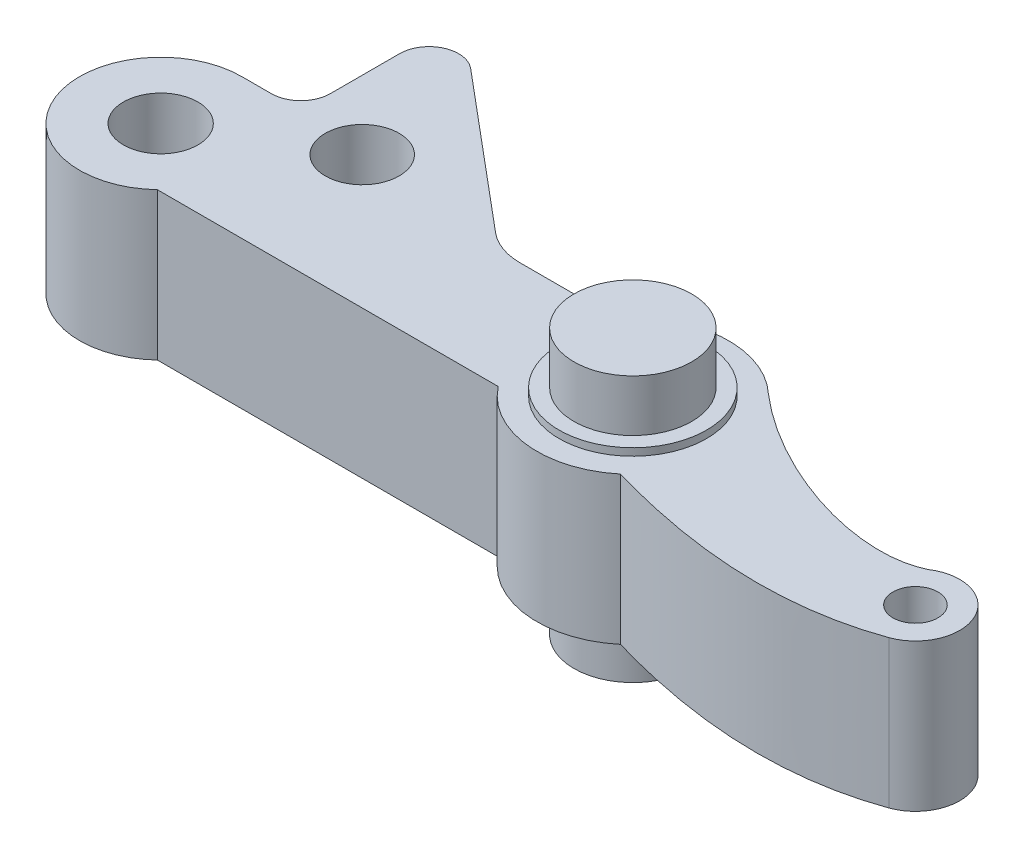
ISO-10303-21;
HEADER;
FILE_DESCRIPTION(('STEP AP214'),'2;1');
FILE_NAME('part.step','',(''),(''),'','','');
FILE_SCHEMA(('AUTOMOTIVE_DESIGN { 1 0 10303 214 1 1 1 1 }'));
ENDSEC;
DATA;
#1=APPLICATION_CONTEXT('core data for automotive mechanical design processes');
#2=APPLICATION_PROTOCOL_DEFINITION('international standard','automotive_design',2000,#1);
#3=PRODUCT_CONTEXT('',#1,'mechanical');
#4=PRODUCT('Part','Part','',(#3));
#5=PRODUCT_RELATED_PRODUCT_CATEGORY('part','',(#4));
#6=PRODUCT_DEFINITION_FORMATION('','',#4);
#7=PRODUCT_DEFINITION_CONTEXT('part definition',#1,'design');
#8=PRODUCT_DEFINITION('design','',#6,#7);
#9=PRODUCT_DEFINITION_SHAPE('','',#8);
#10=(LENGTH_UNIT() NAMED_UNIT(*) SI_UNIT(.MILLI.,.METRE.));
#11=(NAMED_UNIT(*) PLANE_ANGLE_UNIT() SI_UNIT($,.RADIAN.));
#12=(NAMED_UNIT(*) SI_UNIT($,.STERADIAN.) SOLID_ANGLE_UNIT());
#13=UNCERTAINTY_MEASURE_WITH_UNIT(LENGTH_MEASURE(1.E-05),#10,'distance_accuracy_value','');
#14=(GEOMETRIC_REPRESENTATION_CONTEXT(3) GLOBAL_UNCERTAINTY_ASSIGNED_CONTEXT((#13)) GLOBAL_UNIT_ASSIGNED_CONTEXT((#10,
#11,#12)) REPRESENTATION_CONTEXT('',''));
#15=CARTESIAN_POINT('',(0.,0.,0.));
#16=DIRECTION('',(0.,0.,1.));
#17=DIRECTION('',(1.,0.,0.));
#18=AXIS2_PLACEMENT_3D('',#15,#16,#17);
#19=CARTESIAN_POINT('',(-26.,10.,-12.1938724783223));
#20=DIRECTION('',(0.,-1.,0.));
#21=DIRECTION('',(0.,0.,-1.));
#22=AXIS2_PLACEMENT_3D('',#19,#20,#21);
#23=PLANE('',#22);
#24=CARTESIAN_POINT('',(-32.,10.,0.));
#25=DIRECTION('',(0.,1.,0.));
#26=DIRECTION('',(0.,0.,1.));
#27=AXIS2_PLACEMENT_3D('',#24,#25,#26);
#28=CIRCLE('',#27,2.52500000000001);
#29=CARTESIAN_POINT('',(-32.,10.,2.52500000000002));
#30=VERTEX_POINT('',#29);
#31=EDGE_CURVE('E328',#30,#30,#28,.T.);
#32=ORIENTED_EDGE('',*,*,#31,.F.);
#33=EDGE_LOOP('',(#32));
#34=FACE_BOUND('',#33,.T.);
#35=CARTESIAN_POINT('',(0.,10.,0.));
#36=DIRECTION('',(0.,-1.,0.));
#37=DIRECTION('',(0.,0.,-1.));
#38=AXIS2_PLACEMENT_3D('',#35,#36,#37);
#39=CIRCLE('',#38,5.);
#40=CARTESIAN_POINT('',(0.,10.,-5.));
#41=VERTEX_POINT('',#40);
#42=EDGE_CURVE('E358',#41,#41,#39,.T.);
#43=ORIENTED_EDGE('',*,*,#42,.T.);
#44=EDGE_LOOP('',(#43));
#45=FACE_BOUND('',#44,.T.);
#46=DIRECTION('',(1.,0.,0.));
#47=VECTOR('',#46,1.);
#48=CARTESIAN_POINT('',(-32.,10.,-5.5));
#49=LINE('',#48,#47);
#50=CARTESIAN_POINT('',(-32.,10.,-5.49999999999999));
#51=VERTEX_POINT('',#50);
#52=CARTESIAN_POINT('',(-30.,10.,-5.5));
#53=VERTEX_POINT('',#52);
#54=EDGE_CURVE('E146',#51,#53,#49,.T.);
#55=ORIENTED_EDGE('',*,*,#54,.F.);
#56=CARTESIAN_POINT('',(-32.,10.,0.));
#57=DIRECTION('',(0.,-1.,0.));
#58=DIRECTION('',(0.,0.,-1.));
#59=AXIS2_PLACEMENT_3D('',#56,#57,#58);
#60=CIRCLE('',#59,5.49999999999999);
#61=CARTESIAN_POINT('',(-28.2250827823647,10.,4.));
#62=VERTEX_POINT('',#61);
#63=EDGE_CURVE('E154',#62,#51,#60,.T.);
#64=ORIENTED_EDGE('',*,*,#63,.F.);
#65=DIRECTION('',(-1.,0.,0.));
#66=VECTOR('',#65,1.);
#67=CARTESIAN_POINT('',(-5.1234753829798,10.,4.));
#68=LINE('',#67,#66);
#69=CARTESIAN_POINT('',(-5.1234753829798,10.,4.));
#70=VERTEX_POINT('',#69);
#71=EDGE_CURVE('E255',#70,#62,#68,.T.);
#72=ORIENTED_EDGE('',*,*,#71,.F.);
#73=CARTESIAN_POINT('',(0.,10.,0.));
#74=DIRECTION('',(0.,-1.,0.));
#75=DIRECTION('',(0.,0.,-1.));
#76=AXIS2_PLACEMENT_3D('',#73,#74,#75);
#77=CIRCLE('',#76,6.5);
#78=CARTESIAN_POINT('',(4.15942052119713,10.,4.99491951164838));
#79=VERTEX_POINT('',#78);
#80=EDGE_CURVE('E249',#79,#70,#77,.T.);
#81=ORIENTED_EDGE('',*,*,#80,.F.);
#82=CARTESIAN_POINT('',(22.8496559981528,10.,5.50469290991867));
#83=CARTESIAN_POINT('',(17.7838552462063,10.,7.32327946457683));
#84=CARTESIAN_POINT('',(11.5537767538877,10.,7.15335499848673));
#85=CARTESIAN_POINT('',(4.15942052119713,10.,4.99491951164838));
#86=B_SPLINE_CURVE_WITH_KNOTS('',3,(#82,#83,#84,#85),.UNSPECIFIED.,.F.,.F.,(4,4),(0.,1.),.UNSPECIFIED.);
#87=CARTESIAN_POINT('',(22.8496559981528,10.,5.50469290991856));
#88=VERTEX_POINT('',#87);
#89=EDGE_CURVE('E243',#88,#79,#86,.T.);
#90=ORIENTED_EDGE('',*,*,#89,.F.);
#91=CARTESIAN_POINT('',(21.8360153361091,10.,2.68112555491325));
#92=DIRECTION('',(0.,-1.,0.));
#93=DIRECTION('',(0.,0.,-1.));
#94=AXIS2_PLACEMENT_3D('',#91,#92,#93);
#95=CIRCLE('',#94,3.);
#96=CARTESIAN_POINT('',(20.4900711475222,10.,0.));
#97=VERTEX_POINT('',#96);
#98=EDGE_CURVE('E174',#97,#88,#95,.T.);
#99=ORIENTED_EDGE('',*,*,#98,.F.);
#100=CARTESIAN_POINT('',(11.3103056014406,10.,-6.2061755129489));
#101=DIRECTION('',(0.,1.,0.));
#102=DIRECTION('',(0.887202630692194,0.,0.461379986662675));
#103=AXIS2_PLACEMENT_3D('',#100,#101,#102);
#104=ELLIPSE('',#103,11.3690828500157,5.08067932889117);
#105=CARTESIAN_POINT('',(4.46665949634498,10.,-4.72217671669649));
#106=VERTEX_POINT('',#105);
#107=EDGE_CURVE('E170',#106,#97,#104,.T.);
#108=ORIENTED_EDGE('',*,*,#107,.F.);
#109=CARTESIAN_POINT('',(0.,10.,0.));
#110=DIRECTION('',(0.,-1.,0.));
#111=DIRECTION('',(0.,0.,-1.));
#112=AXIS2_PLACEMENT_3D('',#109,#110,#111);
#113=CIRCLE('',#112,6.49999999999994);
#114=CARTESIAN_POINT('',(-5.1234753829798,10.,-4.));
#115=VERTEX_POINT('',#114);
#116=EDGE_CURVE('E167',#115,#106,#113,.T.);
#117=ORIENTED_EDGE('',*,*,#116,.F.);
#118=DIRECTION('',(1.,0.,0.));
#119=VECTOR('',#118,1.);
#120=CARTESIAN_POINT('',(-13.1234753829798,10.,-3.99999999999985));
#121=LINE('',#120,#119);
#122=CARTESIAN_POINT('',(-11.6675944459149,10.,-3.99999999999988));
#123=VERTEX_POINT('',#122);
#124=EDGE_CURVE('E162',#123,#115,#121,.T.);
#125=ORIENTED_EDGE('',*,*,#124,.F.);
#126=CARTESIAN_POINT('',(-11.667594445915,10.,-7.99999999999988));
#127=DIRECTION('',(0.,-1.,0.));
#128=DIRECTION('',(0.,0.,-1.));
#129=AXIS2_PLACEMENT_3D('',#126,#127,#128);
#130=CIRCLE('',#129,4.);
#131=CARTESIAN_POINT('',(-14.2387448846612,10.,-4.93582222752399));
#132=VERTEX_POINT('',#131);
#133=EDGE_CURVE('E11',#123,#132,#130,.T.);
#134=ORIENTED_EDGE('',*,*,#133,.T.);
#135=DIRECTION('',(0.766044443118972,0.,0.642787609686547));
#136=VECTOR('',#135,1.);
#137=CARTESIAN_POINT('',(-24.7144247806269,10.,-13.7259613645602));
#138=LINE('',#137,#136);
#139=CARTESIAN_POINT('',(-24.7144247806269,10.,-13.7259613645602));
#140=VERTEX_POINT('',#139);
#141=EDGE_CURVE('E160',#140,#132,#138,.T.);
#142=ORIENTED_EDGE('',*,*,#141,.F.);
#143=CARTESIAN_POINT('',(-26.,10.,-12.1938724783223));
#144=DIRECTION('',(0.,-1.,0.));
#145=DIRECTION('',(0.,0.,-1.));
#146=AXIS2_PLACEMENT_3D('',#143,#144,#145);
#147=CIRCLE('',#146,2.);
#148=CARTESIAN_POINT('',(-28.,10.,-12.1938724783223));
#149=VERTEX_POINT('',#148);
#150=EDGE_CURVE('E145',#149,#140,#147,.T.);
#151=ORIENTED_EDGE('',*,*,#150,.F.);
#152=DIRECTION('',(0.,0.,-1.));
#153=VECTOR('',#152,1.);
#154=CARTESIAN_POINT('',(-28.,10.,-5.5));
#155=LINE('',#154,#153);
#156=CARTESIAN_POINT('',(-28.,10.,-7.5));
#157=VERTEX_POINT('',#156);
#158=EDGE_CURVE('E134',#157,#149,#155,.T.);
#159=ORIENTED_EDGE('',*,*,#158,.F.);
#160=CARTESIAN_POINT('',(-30.,10.,-7.5));
#161=DIRECTION('',(0.,-1.,0.));
#162=DIRECTION('',(0.,0.,-1.));
#163=AXIS2_PLACEMENT_3D('',#160,#161,#162);
#164=CIRCLE('',#163,2.);
#165=EDGE_CURVE('E334',#157,#53,#164,.T.);
#166=ORIENTED_EDGE('',*,*,#165,.T.);
#167=EDGE_LOOP('',(#55,#64,#72,#81,#90,#99,#108,#117,#125,#134,#142,#151,#159,#166));
#168=FACE_BOUND('',#167,.T.);
#169=CARTESIAN_POINT('',(21.8360153361091,10.,2.68112555491325));
#170=DIRECTION('',(0.,1.,0.));
#171=DIRECTION('',(0.,0.,1.));
#172=AXIS2_PLACEMENT_3D('',#169,#170,#171);
#173=CIRCLE('',#172,1.52500000000001);
#174=CARTESIAN_POINT('',(21.8360153361091,10.,4.20612555491326));
#175=VERTEX_POINT('',#174);
#176=EDGE_CURVE('E323',#175,#175,#173,.T.);
#177=ORIENTED_EDGE('',*,*,#176,.F.);
#178=EDGE_LOOP('',(#177));
#179=FACE_BOUND('',#178,.T.);
#180=CARTESIAN_POINT('',(-23.3397459621556,10.,-5.));
#181=DIRECTION('',(0.,1.,0.));
#182=DIRECTION('',(0.,0.,1.));
#183=AXIS2_PLACEMENT_3D('',#180,#181,#182);
#184=CIRCLE('',#183,2.50500000000001);
#185=CARTESIAN_POINT('',(-23.3397459621556,10.,-2.49499999999999));
#186=VERTEX_POINT('',#185);
#187=EDGE_CURVE('E327',#186,#186,#184,.T.);
#188=ORIENTED_EDGE('',*,*,#187,.F.);
#189=EDGE_LOOP('',(#188));
#190=FACE_BOUND('',#189,.T.);
#191=ADVANCED_FACE('F35',(#34,#45,#168,#179,#190),#23,.F.);
#192=CARTESIAN_POINT('',(-32.,10.,-5.5));
#193=DIRECTION('',(0.,0.,-1.));
#194=DIRECTION('',(-1.,0.,0.));
#195=AXIS2_PLACEMENT_3D('',#192,#193,#194);
#196=PLANE('',#195);
#197=ORIENTED_EDGE('',*,*,#54,.T.);
#198=DIRECTION('',(0.,-1.,0.));
#199=VECTOR('',#198,1.);
#200=CARTESIAN_POINT('',(-30.,0.,-5.5));
#201=LINE('',#200,#199);
#202=CARTESIAN_POINT('',(-30.,0.,-5.5));
#203=VERTEX_POINT('',#202);
#204=EDGE_CURVE('E318',#53,#203,#201,.T.);
#205=ORIENTED_EDGE('',*,*,#204,.T.);
#206=DIRECTION('',(1.,0.,0.));
#207=VECTOR('',#206,1.);
#208=CARTESIAN_POINT('',(-32.,0.,-5.5));
#209=LINE('',#208,#207);
#210=CARTESIAN_POINT('',(-32.,0.,-5.49999999999999));
#211=VERTEX_POINT('',#210);
#212=EDGE_CURVE('E260',#211,#203,#209,.T.);
#213=ORIENTED_EDGE('',*,*,#212,.F.);
#214=DIRECTION('',(0.,-1.,0.));
#215=VECTOR('',#214,1.);
#216=CARTESIAN_POINT('',(-32.,10.,-5.49999999999999));
#217=LINE('',#216,#215);
#218=EDGE_CURVE('E297',#51,#211,#217,.T.);
#219=ORIENTED_EDGE('',*,*,#218,.F.);
#220=EDGE_LOOP('',(#197,#205,#213,#219));
#221=FACE_BOUND('',#220,.T.);
#222=ADVANCED_FACE('F200',(#221),#196,.T.);
#223=CARTESIAN_POINT('',(-32.,10.,0.));
#224=DIRECTION('',(0.,-1.,0.));
#225=DIRECTION('',(0.,0.,-1.));
#226=AXIS2_PLACEMENT_3D('',#223,#224,#225);
#227=CYLINDRICAL_SURFACE('',#226,5.49999999999999);
#228=CARTESIAN_POINT('',(-32.,0.,0.));
#229=DIRECTION('',(0.,-1.,0.));
#230=DIRECTION('',(0.,0.,-1.));
#231=AXIS2_PLACEMENT_3D('',#228,#229,#230);
#232=CIRCLE('',#231,5.49999999999999);
#233=CARTESIAN_POINT('',(-28.2250827823647,0.,4.));
#234=VERTEX_POINT('',#233);
#235=EDGE_CURVE('E294',#234,#211,#232,.T.);
#236=ORIENTED_EDGE('',*,*,#235,.F.);
#237=DIRECTION('',(0.,-1.,0.));
#238=VECTOR('',#237,1.);
#239=CARTESIAN_POINT('',(-28.2250827823647,10.,4.));
#240=LINE('',#239,#238);
#241=EDGE_CURVE('E300',#62,#234,#240,.T.);
#242=ORIENTED_EDGE('',*,*,#241,.F.);
#243=ORIENTED_EDGE('',*,*,#63,.T.);
#244=ORIENTED_EDGE('',*,*,#218,.T.);
#245=EDGE_LOOP('',(#236,#242,#243,#244));
#246=FACE_BOUND('',#245,.T.);
#247=ADVANCED_FACE('F202',(#246),#227,.T.);
#248=CARTESIAN_POINT('',(-5.1234753829798,10.,4.));
#249=DIRECTION('',(0.,0.,1.));
#250=DIRECTION('',(1.,0.,0.));
#251=AXIS2_PLACEMENT_3D('',#248,#249,#250);
#252=PLANE('',#251);
#253=DIRECTION('',(-1.,0.,0.));
#254=VECTOR('',#253,1.);
#255=CARTESIAN_POINT('',(-5.1234753829798,0.,4.));
#256=LINE('',#255,#254);
#257=CARTESIAN_POINT('',(-5.1234753829798,0.,4.));
#258=VERTEX_POINT('',#257);
#259=EDGE_CURVE('E291',#258,#234,#256,.T.);
#260=ORIENTED_EDGE('',*,*,#259,.F.);
#261=DIRECTION('',(0.,-1.,0.));
#262=VECTOR('',#261,1.);
#263=CARTESIAN_POINT('',(-5.1234753829798,10.,4.));
#264=LINE('',#263,#262);
#265=EDGE_CURVE('E302',#70,#258,#264,.T.);
#266=ORIENTED_EDGE('',*,*,#265,.F.);
#267=ORIENTED_EDGE('',*,*,#71,.T.);
#268=ORIENTED_EDGE('',*,*,#241,.T.);
#269=EDGE_LOOP('',(#260,#266,#267,#268));
#270=FACE_BOUND('',#269,.T.);
#271=ADVANCED_FACE('F232',(#270),#252,.T.);
#272=CARTESIAN_POINT('',(0.,10.,0.));
#273=DIRECTION('',(0.,-1.,0.));
#274=DIRECTION('',(0.,0.,-1.));
#275=AXIS2_PLACEMENT_3D('',#272,#273,#274);
#276=CYLINDRICAL_SURFACE('',#275,6.5);
#277=CARTESIAN_POINT('',(0.,0.,0.));
#278=DIRECTION('',(0.,-1.,0.));
#279=DIRECTION('',(0.,0.,-1.));
#280=AXIS2_PLACEMENT_3D('',#277,#278,#279);
#281=CIRCLE('',#280,6.5);
#282=CARTESIAN_POINT('',(4.15942052119713,0.,4.99491951164838));
#283=VERTEX_POINT('',#282);
#284=EDGE_CURVE('E285',#283,#258,#281,.T.);
#285=ORIENTED_EDGE('',*,*,#284,.F.);
#286=DIRECTION('',(0.,-1.,0.));
#287=VECTOR('',#286,1.);
#288=CARTESIAN_POINT('',(4.15942052119713,10.,4.99491951164838));
#289=LINE('',#288,#287);
#290=EDGE_CURVE('E304',#79,#283,#289,.T.);
#291=ORIENTED_EDGE('',*,*,#290,.F.);
#292=ORIENTED_EDGE('',*,*,#80,.T.);
#293=ORIENTED_EDGE('',*,*,#265,.T.);
#294=EDGE_LOOP('',(#285,#291,#292,#293));
#295=FACE_BOUND('',#294,.T.);
#296=ADVANCED_FACE('F236',(#295),#276,.T.);
#297=DIRECTION('',(0.,-1.,0.));
#298=VECTOR('',#297,1.);
#299=SURFACE_OF_LINEAR_EXTRUSION('',#86,#298);
#300=CARTESIAN_POINT('',(22.8496559981528,0.,5.50469290991867));
#301=CARTESIAN_POINT('',(17.7838552462063,0.,7.32327946457683));
#302=CARTESIAN_POINT('',(11.5537767538877,0.,7.15335499848673));
#303=CARTESIAN_POINT('',(4.15942052119713,0.,4.99491951164838));
#304=B_SPLINE_CURVE_WITH_KNOTS('',3,(#300,#301,#302,#303),.UNSPECIFIED.,.F.,.F.,(4,4),(0.,1.),.UNSPECIFIED.);
#305=CARTESIAN_POINT('',(22.8496559981528,0.,5.50469290991856));
#306=VERTEX_POINT('',#305);
#307=EDGE_CURVE('E280',#306,#283,#304,.T.);
#308=ORIENTED_EDGE('',*,*,#307,.F.);
#309=DIRECTION('',(0.,-1.,0.));
#310=VECTOR('',#309,1.);
#311=CARTESIAN_POINT('',(22.8496559981528,10.,5.50469290991856));
#312=LINE('',#311,#310);
#313=EDGE_CURVE('E306',#88,#306,#312,.T.);
#314=ORIENTED_EDGE('',*,*,#313,.F.);
#315=ORIENTED_EDGE('',*,*,#89,.T.);
#316=ORIENTED_EDGE('',*,*,#290,.T.);
#317=EDGE_LOOP('',(#308,#314,#315,#316));
#318=FACE_BOUND('',#317,.T.);
#319=ADVANCED_FACE('F239',(#318),#299,.T.);
#320=CARTESIAN_POINT('',(21.8360153361091,10.,2.68112555491325));
#321=DIRECTION('',(0.,-1.,0.));
#322=DIRECTION('',(0.,0.,-1.));
#323=AXIS2_PLACEMENT_3D('',#320,#321,#322);
#324=CYLINDRICAL_SURFACE('',#323,3.);
#325=CARTESIAN_POINT('',(21.8360153361091,0.,2.68112555491325));
#326=DIRECTION('',(0.,-1.,0.));
#327=DIRECTION('',(0.,0.,-1.));
#328=AXIS2_PLACEMENT_3D('',#325,#326,#327);
#329=CIRCLE('',#328,3.);
#330=CARTESIAN_POINT('',(20.4900711475222,0.,0.));
#331=VERTEX_POINT('',#330);
#332=EDGE_CURVE('E277',#331,#306,#329,.T.);
#333=ORIENTED_EDGE('',*,*,#332,.F.);
#334=DIRECTION('',(0.,-1.,0.));
#335=VECTOR('',#334,1.);
#336=CARTESIAN_POINT('',(20.4900711475222,10.,0.));
#337=LINE('',#336,#335);
#338=EDGE_CURVE('E308',#97,#331,#337,.T.);
#339=ORIENTED_EDGE('',*,*,#338,.F.);
#340=ORIENTED_EDGE('',*,*,#98,.T.);
#341=ORIENTED_EDGE('',*,*,#313,.T.);
#342=EDGE_LOOP('',(#333,#339,#340,#341));
#343=FACE_BOUND('',#342,.T.);
#344=ADVANCED_FACE('F182',(#343),#324,.T.);
#345=DIRECTION('',(0.,-1.,0.));
#346=VECTOR('',#345,1.);
#347=SURFACE_OF_LINEAR_EXTRUSION('',#104,#346);
#348=CARTESIAN_POINT('',(11.3103056014406,0.,-6.2061755129489));
#349=DIRECTION('',(0.,1.,0.));
#350=DIRECTION('',(0.887202630692194,0.,0.461379986662675));
#351=AXIS2_PLACEMENT_3D('',#348,#349,#350);
#352=ELLIPSE('',#351,11.3690828500157,5.08067932889117);
#353=CARTESIAN_POINT('',(4.46665949634498,0.,-4.72217671669649));
#354=VERTEX_POINT('',#353);
#355=EDGE_CURVE('E274',#354,#331,#352,.T.);
#356=ORIENTED_EDGE('',*,*,#355,.F.);
#357=DIRECTION('',(0.,-1.,0.));
#358=VECTOR('',#357,1.);
#359=CARTESIAN_POINT('',(4.46665949634498,10.,-4.72217671669649));
#360=LINE('',#359,#358);
#361=EDGE_CURVE('E310',#106,#354,#360,.T.);
#362=ORIENTED_EDGE('',*,*,#361,.F.);
#363=ORIENTED_EDGE('',*,*,#107,.T.);
#364=ORIENTED_EDGE('',*,*,#338,.T.);
#365=EDGE_LOOP('',(#356,#362,#363,#364));
#366=FACE_BOUND('',#365,.T.);
#367=ADVANCED_FACE('F177',(#366),#347,.T.);
#368=CARTESIAN_POINT('',(0.,10.,0.));
#369=DIRECTION('',(0.,-1.,0.));
#370=DIRECTION('',(0.,0.,-1.));
#371=AXIS2_PLACEMENT_3D('',#368,#369,#370);
#372=CYLINDRICAL_SURFACE('',#371,6.49999999999994);
#373=CARTESIAN_POINT('',(0.,0.,0.));
#374=DIRECTION('',(0.,-1.,0.));
#375=DIRECTION('',(0.,0.,-1.));
#376=AXIS2_PLACEMENT_3D('',#373,#374,#375);
#377=CIRCLE('',#376,6.49999999999994);
#378=CARTESIAN_POINT('',(-5.1234753829798,0.,-4.));
#379=VERTEX_POINT('',#378);
#380=EDGE_CURVE('E271',#379,#354,#377,.T.);
#381=ORIENTED_EDGE('',*,*,#380,.F.);
#382=DIRECTION('',(0.,-1.,0.));
#383=VECTOR('',#382,1.);
#384=CARTESIAN_POINT('',(-5.1234753829798,10.,-4.));
#385=LINE('',#384,#383);
#386=EDGE_CURVE('E312',#115,#379,#385,.T.);
#387=ORIENTED_EDGE('',*,*,#386,.F.);
#388=ORIENTED_EDGE('',*,*,#116,.T.);
#389=ORIENTED_EDGE('',*,*,#361,.T.);
#390=EDGE_LOOP('',(#381,#387,#388,#389));
#391=FACE_BOUND('',#390,.T.);
#392=ADVANCED_FACE('F181',(#391),#372,.T.);
#393=CARTESIAN_POINT('',(-13.1234753829798,10.,-3.99999999999985));
#394=DIRECTION('',(0.,0.,-1.));
#395=DIRECTION('',(-1.,0.,0.));
#396=AXIS2_PLACEMENT_3D('',#393,#394,#395);
#397=PLANE('',#396);
#398=DIRECTION('',(1.,0.,0.));
#399=VECTOR('',#398,1.);
#400=CARTESIAN_POINT('',(-13.1234753829798,0.,-3.99999999999985));
#401=LINE('',#400,#399);
#402=CARTESIAN_POINT('',(-11.6675944459149,0.,-3.99999999999988));
#403=VERTEX_POINT('',#402);
#404=EDGE_CURVE('E269',#403,#379,#401,.T.);
#405=ORIENTED_EDGE('',*,*,#404,.F.);
#406=DIRECTION('',(0.,-1.,0.));
#407=VECTOR('',#406,1.);
#408=CARTESIAN_POINT('',(-11.6675944459149,10.,-3.99999999999988));
#409=LINE('',#408,#407);
#410=EDGE_CURVE('E50',#403,#123,#409,.F.);
#411=ORIENTED_EDGE('',*,*,#410,.T.);
#412=ORIENTED_EDGE('',*,*,#124,.T.);
#413=ORIENTED_EDGE('',*,*,#386,.T.);
#414=EDGE_LOOP('',(#405,#411,#412,#413));
#415=FACE_BOUND('',#414,.T.);
#416=ADVANCED_FACE('F187',(#415),#397,.T.);
#417=CARTESIAN_POINT('',(-24.7144247806269,10.,-13.7259613645602));
#418=DIRECTION('',(0.642787609686547,0.,-0.766044443118972));
#419=DIRECTION('',(-0.766044443118972,0.,-0.642787609686547));
#420=AXIS2_PLACEMENT_3D('',#417,#418,#419);
#421=PLANE('',#420);
#422=ORIENTED_EDGE('',*,*,#141,.T.);
#423=DIRECTION('',(0.,-1.,0.));
#424=VECTOR('',#423,1.);
#425=CARTESIAN_POINT('',(-14.2387448846612,0.,-4.93582222752399));
#426=LINE('',#425,#424);
#427=CARTESIAN_POINT('',(-14.2387448846612,0.,-4.93582222752399));
#428=VERTEX_POINT('',#427);
#429=EDGE_CURVE('E336',#132,#428,#426,.T.);
#430=ORIENTED_EDGE('',*,*,#429,.T.);
#431=DIRECTION('',(0.766044443118972,0.,0.642787609686547));
#432=VECTOR('',#431,1.);
#433=CARTESIAN_POINT('',(-24.7144247806269,0.,-13.7259613645602));
#434=LINE('',#433,#432);
#435=CARTESIAN_POINT('',(-24.7144247806269,0.,-13.7259613645602));
#436=VERTEX_POINT('',#435);
#437=EDGE_CURVE('E267',#436,#428,#434,.T.);
#438=ORIENTED_EDGE('',*,*,#437,.F.);
#439=DIRECTION('',(0.,-1.,0.));
#440=VECTOR('',#439,1.);
#441=CARTESIAN_POINT('',(-24.7144247806269,10.,-13.7259613645602));
#442=LINE('',#441,#440);
#443=EDGE_CURVE('E153',#140,#436,#442,.T.);
#444=ORIENTED_EDGE('',*,*,#443,.F.);
#445=EDGE_LOOP('',(#422,#430,#438,#444));
#446=FACE_BOUND('',#445,.T.);
#447=ADVANCED_FACE('F191',(#446),#421,.T.);
#448=CARTESIAN_POINT('',(-26.,10.,-12.1938724783223));
#449=DIRECTION('',(0.,-1.,0.));
#450=DIRECTION('',(0.,0.,-1.));
#451=AXIS2_PLACEMENT_3D('',#448,#449,#450);
#452=CYLINDRICAL_SURFACE('',#451,2.);
#453=CARTESIAN_POINT('',(-26.,0.,-12.1938724783223));
#454=DIRECTION('',(0.,-1.,0.));
#455=DIRECTION('',(0.,0.,-1.));
#456=AXIS2_PLACEMENT_3D('',#453,#454,#455);
#457=CIRCLE('',#456,2.);
#458=CARTESIAN_POINT('',(-28.,0.,-12.1938724783223));
#459=VERTEX_POINT('',#458);
#460=EDGE_CURVE('E152',#459,#436,#457,.T.);
#461=ORIENTED_EDGE('',*,*,#460,.F.);
#462=DIRECTION('',(0.,-1.,0.));
#463=VECTOR('',#462,1.);
#464=CARTESIAN_POINT('',(-28.,10.,-12.1938724783223));
#465=LINE('',#464,#463);
#466=EDGE_CURVE('E138',#149,#459,#465,.T.);
#467=ORIENTED_EDGE('',*,*,#466,.F.);
#468=ORIENTED_EDGE('',*,*,#150,.T.);
#469=ORIENTED_EDGE('',*,*,#443,.T.);
#470=EDGE_LOOP('',(#461,#467,#468,#469));
#471=FACE_BOUND('',#470,.T.);
#472=ADVANCED_FACE('F150',(#471),#452,.T.);
#473=CARTESIAN_POINT('',(-28.,10.,-5.5));
#474=DIRECTION('',(-1.,0.,0.));
#475=DIRECTION('',(0.,0.,1.));
#476=AXIS2_PLACEMENT_3D('',#473,#474,#475);
#477=PLANE('',#476);
#478=DIRECTION('',(0.,0.,-1.));
#479=VECTOR('',#478,1.);
#480=CARTESIAN_POINT('',(-28.,0.,-5.5));
#481=LINE('',#480,#479);
#482=CARTESIAN_POINT('',(-28.,0.,-7.5));
#483=VERTEX_POINT('',#482);
#484=EDGE_CURVE('E263',#483,#459,#481,.T.);
#485=ORIENTED_EDGE('',*,*,#484,.F.);
#486=DIRECTION('',(0.,-1.,0.));
#487=VECTOR('',#486,1.);
#488=CARTESIAN_POINT('',(-28.,10.,-7.5));
#489=LINE('',#488,#487);
#490=EDGE_CURVE('E141',#483,#157,#489,.F.);
#491=ORIENTED_EDGE('',*,*,#490,.T.);
#492=ORIENTED_EDGE('',*,*,#158,.T.);
#493=ORIENTED_EDGE('',*,*,#466,.T.);
#494=EDGE_LOOP('',(#485,#491,#492,#493));
#495=FACE_BOUND('',#494,.T.);
#496=ADVANCED_FACE('F137',(#495),#477,.T.);
#497=CARTESIAN_POINT('',(-26.,0.,-12.1938724783223));
#498=DIRECTION('',(0.,-1.,0.));
#499=DIRECTION('',(0.,0.,-1.));
#500=AXIS2_PLACEMENT_3D('',#497,#498,#499);
#501=PLANE('',#500);
#502=CARTESIAN_POINT('',(-32.,0.,0.));
#503=DIRECTION('',(0.,-1.,0.));
#504=DIRECTION('',(0.,0.,-1.));
#505=AXIS2_PLACEMENT_3D('',#502,#503,#504);
#506=CIRCLE('',#505,2.52500000000001);
#507=CARTESIAN_POINT('',(-32.,0.,-2.52500000000001));
#508=VERTEX_POINT('',#507);
#509=EDGE_CURVE('E324',#508,#508,#506,.T.);
#510=ORIENTED_EDGE('',*,*,#509,.F.);
#511=EDGE_LOOP('',(#510));
#512=FACE_BOUND('',#511,.T.);
#513=CARTESIAN_POINT('',(-23.3397459621556,0.,-5.));
#514=DIRECTION('',(0.,-1.,0.));
#515=DIRECTION('',(0.,0.,-1.));
#516=AXIS2_PLACEMENT_3D('',#513,#514,#515);
#517=CIRCLE('',#516,2.50500000000001);
#518=CARTESIAN_POINT('',(-23.3397459621556,0.,-7.50500000000001));
#519=VERTEX_POINT('',#518);
#520=EDGE_CURVE('E368',#519,#519,#517,.T.);
#521=ORIENTED_EDGE('',*,*,#520,.F.);
#522=EDGE_LOOP('',(#521));
#523=FACE_BOUND('',#522,.T.);
#524=CARTESIAN_POINT('',(21.8360153361091,0.,2.68112555491325));
#525=DIRECTION('',(0.,-1.,0.));
#526=DIRECTION('',(0.,0.,-1.));
#527=AXIS2_PLACEMENT_3D('',#524,#525,#526);
#528=CIRCLE('',#527,1.52500000000001);
#529=CARTESIAN_POINT('',(21.8360153361091,0.,1.15612555491324));
#530=VERTEX_POINT('',#529);
#531=EDGE_CURVE('E319',#530,#530,#528,.T.);
#532=ORIENTED_EDGE('',*,*,#531,.F.);
#533=EDGE_LOOP('',(#532));
#534=FACE_BOUND('',#533,.T.);
#535=CARTESIAN_POINT('',(0.,0.,0.));
#536=DIRECTION('',(0.,-1.,0.));
#537=DIRECTION('',(0.,0.,-1.));
#538=AXIS2_PLACEMENT_3D('',#535,#536,#537);
#539=CIRCLE('',#538,5.);
#540=CARTESIAN_POINT('',(0.,0.,-5.));
#541=VERTEX_POINT('',#540);
#542=EDGE_CURVE('E299',#541,#541,#539,.T.);
#543=ORIENTED_EDGE('',*,*,#542,.F.);
#544=EDGE_LOOP('',(#543));
#545=FACE_BOUND('',#544,.T.);
#546=ORIENTED_EDGE('',*,*,#212,.T.);
#547=CARTESIAN_POINT('',(-30.,0.,-7.5));
#548=DIRECTION('',(0.,-1.,0.));
#549=DIRECTION('',(0.,0.,-1.));
#550=AXIS2_PLACEMENT_3D('',#547,#548,#549);
#551=CIRCLE('',#550,2.);
#552=EDGE_CURVE('E332',#203,#483,#551,.F.);
#553=ORIENTED_EDGE('',*,*,#552,.T.);
#554=ORIENTED_EDGE('',*,*,#484,.T.);
#555=ORIENTED_EDGE('',*,*,#460,.T.);
#556=ORIENTED_EDGE('',*,*,#437,.T.);
#557=CARTESIAN_POINT('',(-11.667594445915,0.,-7.99999999999988));
#558=DIRECTION('',(0.,-1.,0.));
#559=DIRECTION('',(0.,0.,-1.));
#560=AXIS2_PLACEMENT_3D('',#557,#558,#559);
#561=CIRCLE('',#560,4.);
#562=EDGE_CURVE('E43',#428,#403,#561,.F.);
#563=ORIENTED_EDGE('',*,*,#562,.T.);
#564=ORIENTED_EDGE('',*,*,#404,.T.);
#565=ORIENTED_EDGE('',*,*,#380,.T.);
#566=ORIENTED_EDGE('',*,*,#355,.T.);
#567=ORIENTED_EDGE('',*,*,#332,.T.);
#568=ORIENTED_EDGE('',*,*,#307,.T.);
#569=ORIENTED_EDGE('',*,*,#284,.T.);
#570=ORIENTED_EDGE('',*,*,#259,.T.);
#571=ORIENTED_EDGE('',*,*,#235,.T.);
#572=EDGE_LOOP('',(#546,#553,#554,#555,#556,#563,#564,#565,#566,#567,#568,#569,#570,#571));
#573=FACE_BOUND('',#572,.T.);
#574=ADVANCED_FACE('F199',(#512,#523,#534,#545,#573),#501,.T.);
#575=CARTESIAN_POINT('',(0.,-4.,0.));
#576=DIRECTION('',(0.,1.,0.));
#577=DIRECTION('',(0.,0.,1.));
#578=AXIS2_PLACEMENT_3D('',#575,#576,#577);
#579=CYLINDRICAL_SURFACE('',#578,3.99);
#580=CARTESIAN_POINT('',(0.,-4.,0.));
#581=DIRECTION('',(0.,1.,0.));
#582=DIRECTION('',(0.,0.,1.));
#583=AXIS2_PLACEMENT_3D('',#580,#581,#582);
#584=CIRCLE('',#583,3.99);
#585=CARTESIAN_POINT('',(0.,-4.,3.99));
#586=VERTEX_POINT('',#585);
#587=EDGE_CURVE('E264',#586,#586,#584,.T.);
#588=ORIENTED_EDGE('',*,*,#587,.T.);
#589=EDGE_LOOP('',(#588));
#590=FACE_BOUND('',#589,.T.);
#591=CARTESIAN_POINT('',(0.,-0.5,0.));
#592=DIRECTION('',(0.,1.,0.));
#593=DIRECTION('',(0.,0.,1.));
#594=AXIS2_PLACEMENT_3D('',#591,#592,#593);
#595=CIRCLE('',#594,3.99);
#596=CARTESIAN_POINT('',(0.,-0.5,3.99));
#597=VERTEX_POINT('',#596);
#598=EDGE_CURVE('E352',#597,#597,#595,.T.);
#599=ORIENTED_EDGE('',*,*,#598,.F.);
#600=EDGE_LOOP('',(#599));
#601=FACE_BOUND('',#600,.T.);
#602=ADVANCED_FACE('F225',(#590,#601),#579,.T.);
#603=CARTESIAN_POINT('',(3.99,-4.,0.));
#604=DIRECTION('',(0.,-1.,0.));
#605=DIRECTION('',(0.,0.,-1.));
#606=AXIS2_PLACEMENT_3D('',#603,#604,#605);
#607=PLANE('',#606);
#608=ORIENTED_EDGE('',*,*,#587,.F.);
#609=EDGE_LOOP('',(#608));
#610=FACE_BOUND('',#609,.T.);
#611=ADVANCED_FACE('F410',(#610),#607,.T.);
#612=CARTESIAN_POINT('',(0.,-4.,0.));
#613=DIRECTION('',(0.,1.,0.));
#614=DIRECTION('',(0.,0.,1.));
#615=AXIS2_PLACEMENT_3D('',#612,#613,#614);
#616=CYLINDRICAL_SURFACE('',#615,5.);
#617=CARTESIAN_POINT('',(0.,-0.5,0.));
#618=DIRECTION('',(0.,1.,0.));
#619=DIRECTION('',(0.,0.,1.));
#620=AXIS2_PLACEMENT_3D('',#617,#618,#619);
#621=CIRCLE('',#620,5.);
#622=CARTESIAN_POINT('',(0.,-0.5,5.));
#623=VERTEX_POINT('',#622);
#624=EDGE_CURVE('E349',#623,#623,#621,.T.);
#625=ORIENTED_EDGE('',*,*,#624,.T.);
#626=EDGE_LOOP('',(#625));
#627=FACE_BOUND('',#626,.T.);
#628=ORIENTED_EDGE('',*,*,#542,.T.);
#629=EDGE_LOOP('',(#628));
#630=FACE_BOUND('',#629,.T.);
#631=ADVANCED_FACE('F407',(#627,#630),#616,.T.);
#632=CARTESIAN_POINT('',(5.,-0.5,0.));
#633=DIRECTION('',(0.,-1.,0.));
#634=DIRECTION('',(0.,0.,-1.));
#635=AXIS2_PLACEMENT_3D('',#632,#633,#634);
#636=PLANE('',#635);
#637=ORIENTED_EDGE('',*,*,#598,.T.);
#638=EDGE_LOOP('',(#637));
#639=FACE_BOUND('',#638,.T.);
#640=ORIENTED_EDGE('',*,*,#624,.F.);
#641=EDGE_LOOP('',(#640));
#642=FACE_BOUND('',#641,.T.);
#643=ADVANCED_FACE('F403',(#639,#642),#636,.T.);
#644=CARTESIAN_POINT('',(0.,14.,0.));
#645=DIRECTION('',(0.,-1.,0.));
#646=DIRECTION('',(0.,0.,-1.));
#647=AXIS2_PLACEMENT_3D('',#644,#645,#646);
#648=CYLINDRICAL_SURFACE('',#647,3.99);
#649=CARTESIAN_POINT('',(0.,14.,0.));
#650=DIRECTION('',(0.,-1.,0.));
#651=DIRECTION('',(0.,0.,-1.));
#652=AXIS2_PLACEMENT_3D('',#649,#650,#651);
#653=CIRCLE('',#652,3.99);
#654=CARTESIAN_POINT('',(0.,14.,-3.99));
#655=VERTEX_POINT('',#654);
#656=EDGE_CURVE('E355',#655,#655,#653,.T.);
#657=ORIENTED_EDGE('',*,*,#656,.T.);
#658=EDGE_LOOP('',(#657));
#659=FACE_BOUND('',#658,.T.);
#660=CARTESIAN_POINT('',(0.,10.5,0.));
#661=DIRECTION('',(0.,-1.,0.));
#662=DIRECTION('',(0.,0.,-1.));
#663=AXIS2_PLACEMENT_3D('',#660,#661,#662);
#664=CIRCLE('',#663,3.99);
#665=CARTESIAN_POINT('',(0.,10.5,-3.99));
#666=VERTEX_POINT('',#665);
#667=EDGE_CURVE('E322',#666,#666,#664,.T.);
#668=ORIENTED_EDGE('',*,*,#667,.F.);
#669=EDGE_LOOP('',(#668));
#670=FACE_BOUND('',#669,.T.);
#671=ADVANCED_FACE('F399',(#659,#670),#648,.T.);
#672=CARTESIAN_POINT('',(3.99,14.,0.));
#673=DIRECTION('',(0.,1.,0.));
#674=DIRECTION('',(0.,0.,1.));
#675=AXIS2_PLACEMENT_3D('',#672,#673,#674);
#676=PLANE('',#675);
#677=ORIENTED_EDGE('',*,*,#656,.F.);
#678=EDGE_LOOP('',(#677));
#679=FACE_BOUND('',#678,.T.);
#680=ADVANCED_FACE('F395',(#679),#676,.T.);
#681=CARTESIAN_POINT('',(0.,14.,0.));
#682=DIRECTION('',(0.,-1.,0.));
#683=DIRECTION('',(0.,0.,-1.));
#684=AXIS2_PLACEMENT_3D('',#681,#682,#683);
#685=CYLINDRICAL_SURFACE('',#684,5.);
#686=CARTESIAN_POINT('',(0.,10.5,0.));
#687=DIRECTION('',(0.,-1.,0.));
#688=DIRECTION('',(0.,0.,-1.));
#689=AXIS2_PLACEMENT_3D('',#686,#687,#688);
#690=CIRCLE('',#689,5.);
#691=CARTESIAN_POINT('',(0.,10.5,-5.));
#692=VERTEX_POINT('',#691);
#693=EDGE_CURVE('E361',#692,#692,#690,.T.);
#694=ORIENTED_EDGE('',*,*,#693,.T.);
#695=EDGE_LOOP('',(#694));
#696=FACE_BOUND('',#695,.T.);
#697=ORIENTED_EDGE('',*,*,#42,.F.);
#698=EDGE_LOOP('',(#697));
#699=FACE_BOUND('',#698,.T.);
#700=ADVANCED_FACE('F391',(#696,#699),#685,.T.);
#701=CARTESIAN_POINT('',(5.,10.5,0.));
#702=DIRECTION('',(0.,1.,0.));
#703=DIRECTION('',(0.,0.,1.));
#704=AXIS2_PLACEMENT_3D('',#701,#702,#703);
#705=PLANE('',#704);
#706=ORIENTED_EDGE('',*,*,#667,.T.);
#707=EDGE_LOOP('',(#706));
#708=FACE_BOUND('',#707,.T.);
#709=ORIENTED_EDGE('',*,*,#693,.F.);
#710=EDGE_LOOP('',(#709));
#711=FACE_BOUND('',#710,.T.);
#712=ADVANCED_FACE('F385',(#708,#711),#705,.T.);
#713=CARTESIAN_POINT('',(21.8360153361091,10.,2.68112555491325));
#714=DIRECTION('',(0.,1.,0.));
#715=DIRECTION('',(0.,0.,1.));
#716=AXIS2_PLACEMENT_3D('',#713,#714,#715);
#717=CYLINDRICAL_SURFACE('',#716,1.52500000000001);
#718=ORIENTED_EDGE('',*,*,#531,.T.);
#719=EDGE_LOOP('',(#718));
#720=FACE_BOUND('',#719,.T.);
#721=ORIENTED_EDGE('',*,*,#176,.T.);
#722=EDGE_LOOP('',(#721));
#723=FACE_BOUND('',#722,.T.);
#724=ADVANCED_FACE('F379',(#720,#723),#717,.F.);
#725=CARTESIAN_POINT('',(-23.3397459621556,10.,-5.));
#726=DIRECTION('',(0.,1.,0.));
#727=DIRECTION('',(0.,0.,1.));
#728=AXIS2_PLACEMENT_3D('',#725,#726,#727);
#729=CYLINDRICAL_SURFACE('',#728,2.50500000000001);
#730=ORIENTED_EDGE('',*,*,#520,.T.);
#731=EDGE_LOOP('',(#730));
#732=FACE_BOUND('',#731,.T.);
#733=ORIENTED_EDGE('',*,*,#187,.T.);
#734=EDGE_LOOP('',(#733));
#735=FACE_BOUND('',#734,.T.);
#736=ADVANCED_FACE('F213',(#732,#735),#729,.F.);
#737=CARTESIAN_POINT('',(-32.,10.,0.));
#738=DIRECTION('',(0.,1.,0.));
#739=DIRECTION('',(0.,0.,1.));
#740=AXIS2_PLACEMENT_3D('',#737,#738,#739);
#741=CYLINDRICAL_SURFACE('',#740,2.52500000000001);
#742=ORIENTED_EDGE('',*,*,#509,.T.);
#743=EDGE_LOOP('',(#742));
#744=FACE_BOUND('',#743,.T.);
#745=ORIENTED_EDGE('',*,*,#31,.T.);
#746=EDGE_LOOP('',(#745));
#747=FACE_BOUND('',#746,.T.);
#748=ADVANCED_FACE('F206',(#744,#747),#741,.F.);
#749=CARTESIAN_POINT('',(-30.,10.,-7.5));
#750=DIRECTION('',(0.,1.,0.));
#751=DIRECTION('',(0.,0.,1.));
#752=AXIS2_PLACEMENT_3D('',#749,#750,#751);
#753=CYLINDRICAL_SURFACE('',#752,2.);
#754=ORIENTED_EDGE('',*,*,#165,.F.);
#755=ORIENTED_EDGE('',*,*,#490,.F.);
#756=ORIENTED_EDGE('',*,*,#552,.F.);
#757=ORIENTED_EDGE('',*,*,#204,.F.);
#758=EDGE_LOOP('',(#754,#755,#756,#757));
#759=FACE_BOUND('',#758,.T.);
#760=ADVANCED_FACE('F204',(#759),#753,.F.);
#761=CARTESIAN_POINT('',(-11.667594445915,10.,-7.99999999999988));
#762=DIRECTION('',(0.,1.,0.));
#763=DIRECTION('',(0.,0.,1.));
#764=AXIS2_PLACEMENT_3D('',#761,#762,#763);
#765=CYLINDRICAL_SURFACE('',#764,4.);
#766=ORIENTED_EDGE('',*,*,#133,.F.);
#767=ORIENTED_EDGE('',*,*,#410,.F.);
#768=ORIENTED_EDGE('',*,*,#562,.F.);
#769=ORIENTED_EDGE('',*,*,#429,.F.);
#770=EDGE_LOOP('',(#766,#767,#768,#769));
#771=FACE_BOUND('',#770,.T.);
#772=ADVANCED_FACE('F37',(#771),#765,.F.);
#773=CLOSED_SHELL('',(#191,#222,#247,#271,#296,#319,#344,#367,#392,#416,#447,#472,#496,#574,
#602,#611,#631,#643,#671,#680,#700,#712,#724,#736,#748,#760,#772));
#774=MANIFOLD_SOLID_BREP('B2',#773);
#775=ADVANCED_BREP_SHAPE_REPRESENTATION('',(#18,#774),#14);
#776=SHAPE_DEFINITION_REPRESENTATION(#9,#775);
ENDSEC;
END-ISO-10303-21;
